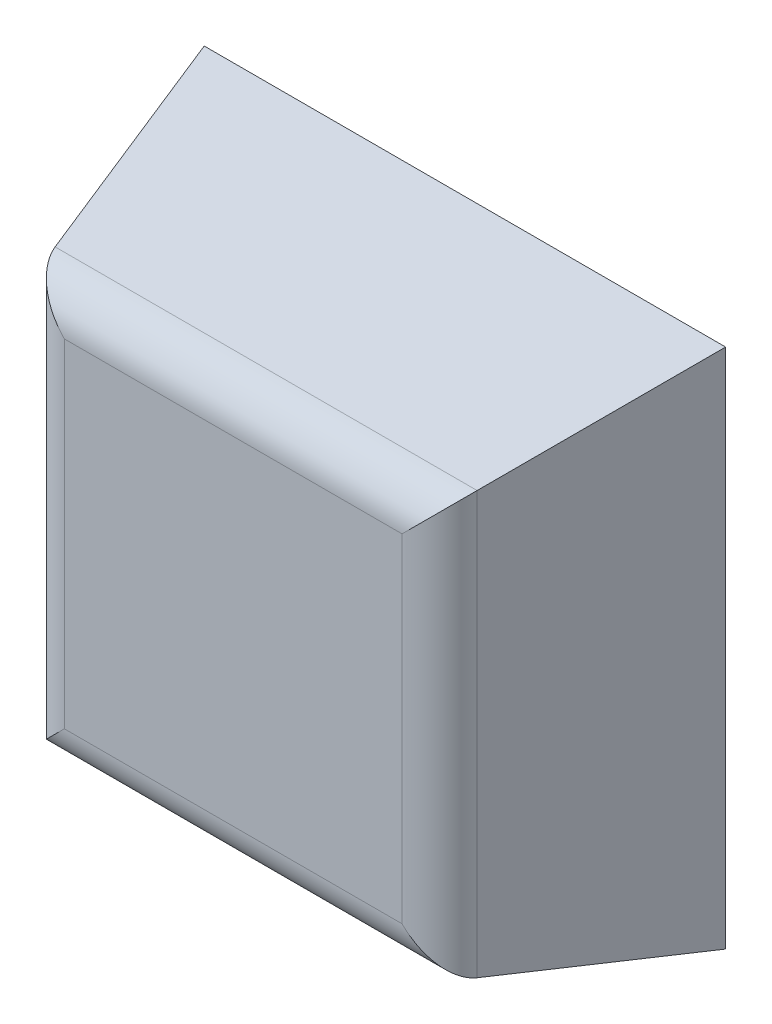
ISO-10303-21;
HEADER;
FILE_DESCRIPTION(('STEP AP214'),'2;1');
FILE_NAME('part.step','',(''),(''),'','','');
FILE_SCHEMA(('AUTOMOTIVE_DESIGN { 1 0 10303 214 1 1 1 1 }'));
ENDSEC;
DATA;
#1=APPLICATION_CONTEXT('core data for automotive mechanical design processes');
#2=APPLICATION_PROTOCOL_DEFINITION('international standard','automotive_design',2000,#1);
#3=PRODUCT_CONTEXT('',#1,'mechanical');
#4=PRODUCT('Part','Part','',(#3));
#5=PRODUCT_RELATED_PRODUCT_CATEGORY('part','',(#4));
#6=PRODUCT_DEFINITION_FORMATION('','',#4);
#7=PRODUCT_DEFINITION_CONTEXT('part definition',#1,'design');
#8=PRODUCT_DEFINITION('design','',#6,#7);
#9=PRODUCT_DEFINITION_SHAPE('','',#8);
#10=(LENGTH_UNIT() NAMED_UNIT(*) SI_UNIT(.MILLI.,.METRE.));
#11=(NAMED_UNIT(*) PLANE_ANGLE_UNIT() SI_UNIT($,.RADIAN.));
#12=(NAMED_UNIT(*) SI_UNIT($,.STERADIAN.) SOLID_ANGLE_UNIT());
#13=UNCERTAINTY_MEASURE_WITH_UNIT(LENGTH_MEASURE(1.E-05),#10,'distance_accuracy_value','');
#14=(GEOMETRIC_REPRESENTATION_CONTEXT(3) GLOBAL_UNCERTAINTY_ASSIGNED_CONTEXT((#13)) GLOBAL_UNIT_ASSIGNED_CONTEXT((#10,
#11,#12)) REPRESENTATION_CONTEXT('',''));
#15=CARTESIAN_POINT('',(0.,0.,0.));
#16=DIRECTION('',(0.,0.,1.));
#17=DIRECTION('',(1.,0.,0.));
#18=AXIS2_PLACEMENT_3D('',#15,#16,#17);
#19=CARTESIAN_POINT('',(0.,0.,0.));
#20=DIRECTION('',(0.,0.,1.));
#21=DIRECTION('',(1.,0.,0.));
#22=AXIS2_PLACEMENT_3D('',#19,#20,#21);
#23=PLANE('',#22);
#24=DIRECTION('',(0.,-1.,0.));
#25=VECTOR('',#24,1.);
#26=CARTESIAN_POINT('',(-9.,9.,0.));
#27=LINE('',#26,#25);
#28=CARTESIAN_POINT('',(-9.,9.,0.));
#29=VERTEX_POINT('',#28);
#30=CARTESIAN_POINT('',(-9.,-9.,0.));
#31=VERTEX_POINT('',#30);
#32=EDGE_CURVE('E169',#29,#31,#27,.T.);
#33=ORIENTED_EDGE('',*,*,#32,.F.);
#34=DIRECTION('',(-1.,0.,0.));
#35=VECTOR('',#34,1.);
#36=CARTESIAN_POINT('',(9.,9.,0.));
#37=LINE('',#36,#35);
#38=CARTESIAN_POINT('',(9.,9.,0.));
#39=VERTEX_POINT('',#38);
#40=EDGE_CURVE('E185',#39,#29,#37,.T.);
#41=ORIENTED_EDGE('',*,*,#40,.F.);
#42=DIRECTION('',(0.,1.,0.));
#43=VECTOR('',#42,1.);
#44=CARTESIAN_POINT('',(9.,-9.,0.));
#45=LINE('',#44,#43);
#46=CARTESIAN_POINT('',(9.,-9.,0.));
#47=VERTEX_POINT('',#46);
#48=EDGE_CURVE('E238',#47,#39,#45,.T.);
#49=ORIENTED_EDGE('',*,*,#48,.F.);
#50=DIRECTION('',(1.,0.,0.));
#51=VECTOR('',#50,1.);
#52=CARTESIAN_POINT('',(-9.,-9.,0.));
#53=LINE('',#52,#51);
#54=EDGE_CURVE('E176',#31,#47,#53,.T.);
#55=ORIENTED_EDGE('',*,*,#54,.F.);
#56=EDGE_LOOP('',(#33,#41,#49,#55));
#57=FACE_BOUND('',#56,.T.);
#58=DIRECTION('',(0.,-1.,0.));
#59=VECTOR('',#58,1.);
#60=CARTESIAN_POINT('',(-6.,6.,0.));
#61=LINE('',#60,#59);
#62=CARTESIAN_POINT('',(-6.,6.,0.));
#63=VERTEX_POINT('',#62);
#64=CARTESIAN_POINT('',(-6.,-6.,0.));
#65=VERTEX_POINT('',#64);
#66=EDGE_CURVE('E338',#63,#65,#61,.T.);
#67=ORIENTED_EDGE('',*,*,#66,.T.);
#68=DIRECTION('',(1.,0.,0.));
#69=VECTOR('',#68,1.);
#70=CARTESIAN_POINT('',(-6.,-6.,0.));
#71=LINE('',#70,#69);
#72=CARTESIAN_POINT('',(6.,-6.,0.));
#73=VERTEX_POINT('',#72);
#74=EDGE_CURVE('E167',#65,#73,#71,.T.);
#75=ORIENTED_EDGE('',*,*,#74,.T.);
#76=DIRECTION('',(0.,1.,0.));
#77=VECTOR('',#76,1.);
#78=CARTESIAN_POINT('',(6.,-6.,0.));
#79=LINE('',#78,#77);
#80=CARTESIAN_POINT('',(6.,6.,0.));
#81=VERTEX_POINT('',#80);
#82=EDGE_CURVE('E347',#73,#81,#79,.T.);
#83=ORIENTED_EDGE('',*,*,#82,.T.);
#84=DIRECTION('',(-1.,0.,0.));
#85=VECTOR('',#84,1.);
#86=CARTESIAN_POINT('',(6.,6.,0.));
#87=LINE('',#86,#85);
#88=EDGE_CURVE('E163',#81,#63,#87,.T.);
#89=ORIENTED_EDGE('',*,*,#88,.T.);
#90=EDGE_LOOP('',(#67,#75,#83,#89));
#91=FACE_BOUND('',#90,.T.);
#92=ADVANCED_FACE('F61',(#57,#91),#23,.F.);
#93=CARTESIAN_POINT('',(0.,0.,8.));
#94=DIRECTION('',(0.,0.,1.));
#95=DIRECTION('',(1.,0.,0.));
#96=AXIS2_PLACEMENT_3D('',#93,#94,#95);
#97=PLANE('',#96);
#98=DIRECTION('',(0.,-1.,0.));
#99=VECTOR('',#98,1.);
#100=CARTESIAN_POINT('',(-5.82883539039338,-7.,8.));
#101=LINE('',#100,#99);
#102=CARTESIAN_POINT('',(-5.82883539039338,5.82883539039338,8.));
#103=VERTEX_POINT('',#102);
#104=CARTESIAN_POINT('',(-5.82883539039338,-5.82883539039338,8.));
#105=VERTEX_POINT('',#104);
#106=EDGE_CURVE('E309',#103,#105,#101,.T.);
#107=ORIENTED_EDGE('',*,*,#106,.T.);
#108=DIRECTION('',(1.,0.,0.));
#109=VECTOR('',#108,1.);
#110=CARTESIAN_POINT('',(7.,-5.82883539039338,8.));
#111=LINE('',#110,#109);
#112=CARTESIAN_POINT('',(5.82883539039338,-5.82883539039338,8.));
#113=VERTEX_POINT('',#112);
#114=EDGE_CURVE('E313',#105,#113,#111,.T.);
#115=ORIENTED_EDGE('',*,*,#114,.T.);
#116=DIRECTION('',(0.,1.,0.));
#117=VECTOR('',#116,1.);
#118=CARTESIAN_POINT('',(5.82883539039338,7.,8.));
#119=LINE('',#118,#117);
#120=CARTESIAN_POINT('',(5.82883539039338,5.82883539039338,8.));
#121=VERTEX_POINT('',#120);
#122=EDGE_CURVE('E306',#113,#121,#119,.T.);
#123=ORIENTED_EDGE('',*,*,#122,.T.);
#124=DIRECTION('',(-1.,0.,0.));
#125=VECTOR('',#124,1.);
#126=CARTESIAN_POINT('',(-7.,5.82883539039338,8.));
#127=LINE('',#126,#125);
#128=EDGE_CURVE('E298',#121,#103,#127,.T.);
#129=ORIENTED_EDGE('',*,*,#128,.T.);
#130=EDGE_LOOP('',(#107,#115,#123,#129));
#131=FACE_BOUND('',#130,.T.);
#132=ADVANCED_FACE('F273',(#131),#97,.T.);
#133=CARTESIAN_POINT('',(-8.47058823529412,0.,2.11764705882353));
#134=DIRECTION('',(0.970142500145332,0.,-0.242535625036333));
#135=DIRECTION('',(-0.242535625036333,0.,-0.970142500145332));
#136=AXIS2_PLACEMENT_3D('',#133,#134,#135);
#137=PLANE('',#136);
#138=DIRECTION('',(0.235702260395516,0.235702260395516,0.942809041582063));
#139=VECTOR('',#138,1.);
#140=CARTESIAN_POINT('',(-9.,-9.,0.));
#141=LINE('',#140,#139);
#142=CARTESIAN_POINT('',(-7.28404914061137,-7.28404914061137,6.8638034375545));
#143=VERTEX_POINT('',#142);
#144=EDGE_CURVE('E253',#31,#143,#141,.T.);
#145=ORIENTED_EDGE('',*,*,#144,.T.);
#146=DIRECTION('',(0.,-1.,0.));
#147=VECTOR('',#146,1.);
#148=CARTESIAN_POINT('',(-7.28404914061137,7.,6.8638034375545));
#149=LINE('',#148,#147);
#150=CARTESIAN_POINT('',(-7.28404914061137,7.28404914061137,6.8638034375545));
#151=VERTEX_POINT('',#150);
#152=EDGE_CURVE('E316',#143,#151,#149,.F.);
#153=ORIENTED_EDGE('',*,*,#152,.T.);
#154=DIRECTION('',(0.235702260395516,-0.235702260395516,0.942809041582063));
#155=VECTOR('',#154,1.);
#156=CARTESIAN_POINT('',(-9.,9.,0.));
#157=LINE('',#156,#155);
#158=EDGE_CURVE('E233',#29,#151,#157,.T.);
#159=ORIENTED_EDGE('',*,*,#158,.F.);
#160=ORIENTED_EDGE('',*,*,#32,.T.);
#161=EDGE_LOOP('',(#145,#153,#159,#160));
#162=FACE_BOUND('',#161,.T.);
#163=ADVANCED_FACE('F207',(#162),#137,.F.);
#164=CARTESIAN_POINT('',(0.,8.47058823529412,2.11764705882353));
#165=DIRECTION('',(0.,-0.970142500145332,-0.242535625036333));
#166=DIRECTION('',(0.,0.242535625036333,-0.970142500145332));
#167=AXIS2_PLACEMENT_3D('',#164,#165,#166);
#168=PLANE('',#167);
#169=ORIENTED_EDGE('',*,*,#158,.T.);
#170=DIRECTION('',(-1.,0.,0.));
#171=VECTOR('',#170,1.);
#172=CARTESIAN_POINT('',(7.,7.28404914061137,6.8638034375545));
#173=LINE('',#172,#171);
#174=CARTESIAN_POINT('',(7.28404914061137,7.28404914061137,6.8638034375545));
#175=VERTEX_POINT('',#174);
#176=EDGE_CURVE('E12',#151,#175,#173,.F.);
#177=ORIENTED_EDGE('',*,*,#176,.T.);
#178=DIRECTION('',(-0.235702260395516,-0.235702260395516,0.942809041582063));
#179=VECTOR('',#178,1.);
#180=CARTESIAN_POINT('',(9.,9.,0.));
#181=LINE('',#180,#179);
#182=EDGE_CURVE('E191',#39,#175,#181,.T.);
#183=ORIENTED_EDGE('',*,*,#182,.F.);
#184=ORIENTED_EDGE('',*,*,#40,.T.);
#185=EDGE_LOOP('',(#169,#177,#183,#184));
#186=FACE_BOUND('',#185,.T.);
#187=ADVANCED_FACE('F194',(#186),#168,.F.);
#188=CARTESIAN_POINT('',(0.,-8.47058823529412,2.11764705882353));
#189=DIRECTION('',(0.,0.970142500145332,-0.242535625036333));
#190=DIRECTION('',(0.,0.242535625036333,0.970142500145332));
#191=AXIS2_PLACEMENT_3D('',#188,#189,#190);
#192=PLANE('',#191);
#193=DIRECTION('',(-0.235702260395516,0.235702260395516,0.942809041582063));
#194=VECTOR('',#193,1.);
#195=CARTESIAN_POINT('',(9.,-9.,0.));
#196=LINE('',#195,#194);
#197=CARTESIAN_POINT('',(7.28404914061137,-7.28404914061137,6.8638034375545));
#198=VERTEX_POINT('',#197);
#199=EDGE_CURVE('E225',#47,#198,#196,.T.);
#200=ORIENTED_EDGE('',*,*,#199,.T.);
#201=DIRECTION('',(1.,0.,0.));
#202=VECTOR('',#201,1.);
#203=CARTESIAN_POINT('',(-7.,-7.28404914061137,6.8638034375545));
#204=LINE('',#203,#202);
#205=EDGE_CURVE('E72',#198,#143,#204,.F.);
#206=ORIENTED_EDGE('',*,*,#205,.T.);
#207=ORIENTED_EDGE('',*,*,#144,.F.);
#208=ORIENTED_EDGE('',*,*,#54,.T.);
#209=EDGE_LOOP('',(#200,#206,#207,#208));
#210=FACE_BOUND('',#209,.T.);
#211=ADVANCED_FACE('F206',(#210),#192,.F.);
#212=CARTESIAN_POINT('',(8.47058823529412,0.,2.11764705882353));
#213=DIRECTION('',(-0.970142500145332,0.,-0.242535625036333));
#214=DIRECTION('',(-0.242535625036333,0.,0.970142500145332));
#215=AXIS2_PLACEMENT_3D('',#212,#213,#214);
#216=PLANE('',#215);
#217=ORIENTED_EDGE('',*,*,#182,.T.);
#218=DIRECTION('',(0.,1.,0.));
#219=VECTOR('',#218,1.);
#220=CARTESIAN_POINT('',(7.28404914061137,-7.,6.8638034375545));
#221=LINE('',#220,#219);
#222=EDGE_CURVE('E80',#175,#198,#221,.F.);
#223=ORIENTED_EDGE('',*,*,#222,.T.);
#224=ORIENTED_EDGE('',*,*,#199,.F.);
#225=ORIENTED_EDGE('',*,*,#48,.T.);
#226=EDGE_LOOP('',(#217,#223,#224,#225));
#227=FACE_BOUND('',#226,.T.);
#228=ADVANCED_FACE('F214',(#227),#216,.F.);
#229=CARTESIAN_POINT('',(-6.,6.,3.));
#230=DIRECTION('',(1.,0.,0.));
#231=DIRECTION('',(0.,0.,-1.));
#232=AXIS2_PLACEMENT_3D('',#229,#230,#231);
#233=PLANE('',#232);
#234=ORIENTED_EDGE('',*,*,#66,.F.);
#235=DIRECTION('',(0.,0.,-1.));
#236=VECTOR('',#235,1.);
#237=CARTESIAN_POINT('',(-6.,6.,3.));
#238=LINE('',#237,#236);
#239=CARTESIAN_POINT('',(-6.,6.,3.));
#240=VERTEX_POINT('',#239);
#241=EDGE_CURVE('E161',#240,#63,#238,.T.);
#242=ORIENTED_EDGE('',*,*,#241,.F.);
#243=DIRECTION('',(0.,-1.,0.));
#244=VECTOR('',#243,1.);
#245=CARTESIAN_POINT('',(-6.,6.,3.));
#246=LINE('',#245,#244);
#247=CARTESIAN_POINT('',(-6.,-6.,3.));
#248=VERTEX_POINT('',#247);
#249=EDGE_CURVE('E147',#240,#248,#246,.T.);
#250=ORIENTED_EDGE('',*,*,#249,.T.);
#251=DIRECTION('',(0.,0.,-1.));
#252=VECTOR('',#251,1.);
#253=CARTESIAN_POINT('',(-6.,-6.,3.));
#254=LINE('',#253,#252);
#255=EDGE_CURVE('E158',#248,#65,#254,.T.);
#256=ORIENTED_EDGE('',*,*,#255,.T.);
#257=EDGE_LOOP('',(#234,#242,#250,#256));
#258=FACE_BOUND('',#257,.T.);
#259=ADVANCED_FACE('F157',(#258),#233,.T.);
#260=CARTESIAN_POINT('',(-6.,-6.,3.));
#261=DIRECTION('',(0.,1.,0.));
#262=DIRECTION('',(0.,0.,1.));
#263=AXIS2_PLACEMENT_3D('',#260,#261,#262);
#264=PLANE('',#263);
#265=ORIENTED_EDGE('',*,*,#74,.F.);
#266=ORIENTED_EDGE('',*,*,#255,.F.);
#267=DIRECTION('',(1.,0.,0.));
#268=VECTOR('',#267,1.);
#269=CARTESIAN_POINT('',(-6.,-6.,3.));
#270=LINE('',#269,#268);
#271=CARTESIAN_POINT('',(6.,-6.,3.));
#272=VERTEX_POINT('',#271);
#273=EDGE_CURVE('E143',#248,#272,#270,.T.);
#274=ORIENTED_EDGE('',*,*,#273,.T.);
#275=DIRECTION('',(0.,0.,-1.));
#276=VECTOR('',#275,1.);
#277=CARTESIAN_POINT('',(6.,-6.,3.));
#278=LINE('',#277,#276);
#279=EDGE_CURVE('E170',#272,#73,#278,.T.);
#280=ORIENTED_EDGE('',*,*,#279,.T.);
#281=EDGE_LOOP('',(#265,#266,#274,#280));
#282=FACE_BOUND('',#281,.T.);
#283=ADVANCED_FACE('F165',(#282),#264,.T.);
#284=CARTESIAN_POINT('',(6.,-6.,3.));
#285=DIRECTION('',(-1.,0.,0.));
#286=DIRECTION('',(0.,0.,1.));
#287=AXIS2_PLACEMENT_3D('',#284,#285,#286);
#288=PLANE('',#287);
#289=ORIENTED_EDGE('',*,*,#82,.F.);
#290=ORIENTED_EDGE('',*,*,#279,.F.);
#291=DIRECTION('',(0.,1.,0.));
#292=VECTOR('',#291,1.);
#293=CARTESIAN_POINT('',(6.,-6.,3.));
#294=LINE('',#293,#292);
#295=CARTESIAN_POINT('',(6.,6.,3.));
#296=VERTEX_POINT('',#295);
#297=EDGE_CURVE('E148',#272,#296,#294,.T.);
#298=ORIENTED_EDGE('',*,*,#297,.T.);
#299=DIRECTION('',(0.,0.,-1.));
#300=VECTOR('',#299,1.);
#301=CARTESIAN_POINT('',(6.,6.,3.));
#302=LINE('',#301,#300);
#303=EDGE_CURVE('E179',#296,#81,#302,.T.);
#304=ORIENTED_EDGE('',*,*,#303,.T.);
#305=EDGE_LOOP('',(#289,#290,#298,#304));
#306=FACE_BOUND('',#305,.T.);
#307=ADVANCED_FACE('F365',(#306),#288,.T.);
#308=CARTESIAN_POINT('',(6.,6.,3.));
#309=DIRECTION('',(0.,-1.,0.));
#310=DIRECTION('',(0.,0.,-1.));
#311=AXIS2_PLACEMENT_3D('',#308,#309,#310);
#312=PLANE('',#311);
#313=ORIENTED_EDGE('',*,*,#88,.F.);
#314=ORIENTED_EDGE('',*,*,#303,.F.);
#315=DIRECTION('',(-1.,0.,0.));
#316=VECTOR('',#315,1.);
#317=CARTESIAN_POINT('',(6.,6.,3.));
#318=LINE('',#317,#316);
#319=EDGE_CURVE('E350',#296,#240,#318,.T.);
#320=ORIENTED_EDGE('',*,*,#319,.T.);
#321=ORIENTED_EDGE('',*,*,#241,.T.);
#322=EDGE_LOOP('',(#313,#314,#320,#321));
#323=FACE_BOUND('',#322,.T.);
#324=ADVANCED_FACE('F367',(#323),#312,.T.);
#325=CARTESIAN_POINT('',(0.,0.,3.));
#326=DIRECTION('',(0.,0.,1.));
#327=DIRECTION('',(1.,0.,0.));
#328=AXIS2_PLACEMENT_3D('',#325,#326,#327);
#329=PLANE('',#328);
#330=ORIENTED_EDGE('',*,*,#249,.F.);
#331=ORIENTED_EDGE('',*,*,#319,.F.);
#332=ORIENTED_EDGE('',*,*,#297,.F.);
#333=ORIENTED_EDGE('',*,*,#273,.F.);
#334=EDGE_LOOP('',(#330,#331,#332,#333));
#335=FACE_BOUND('',#334,.T.);
#336=ADVANCED_FACE('F145',(#335),#329,.F.);
#337=CARTESIAN_POINT('',(5.82883539039338,0.,6.5));
#338=DIRECTION('',(0.,-1.,0.));
#339=DIRECTION('',(0.,0.,-1.));
#340=AXIS2_PLACEMENT_3D('',#337,#338,#339);
#341=CYLINDRICAL_SURFACE('',#340,1.5);
#342=CARTESIAN_POINT('',(5.82883539039338,-5.82883539039338,6.5));
#343=DIRECTION('',(-0.707106781186547,-0.707106781186547,0.));
#344=DIRECTION('',(-0.707106781186547,0.707106781186547,0.));
#345=AXIS2_PLACEMENT_3D('',#342,#343,#344);
#346=ELLIPSE('',#345,2.12132034355964,1.5);
#347=EDGE_CURVE('E329',#198,#113,#346,.T.);
#348=ORIENTED_EDGE('',*,*,#347,.F.);
#349=ORIENTED_EDGE('',*,*,#222,.F.);
#350=CARTESIAN_POINT('',(5.82883539039338,5.82883539039338,6.5));
#351=DIRECTION('',(0.707106781186547,-0.707106781186547,0.));
#352=DIRECTION('',(0.707106781186547,0.707106781186547,0.));
#353=AXIS2_PLACEMENT_3D('',#350,#351,#352);
#354=ELLIPSE('',#353,2.12132034355964,1.5);
#355=EDGE_CURVE('E66',#121,#175,#354,.F.);
#356=ORIENTED_EDGE('',*,*,#355,.F.);
#357=ORIENTED_EDGE('',*,*,#122,.F.);
#358=EDGE_LOOP('',(#348,#349,#356,#357));
#359=FACE_BOUND('',#358,.T.);
#360=ADVANCED_FACE('F64',(#359),#341,.T.);
#361=CARTESIAN_POINT('',(0.,5.82883539039338,6.5));
#362=DIRECTION('',(1.,0.,0.));
#363=DIRECTION('',(0.,0.,-1.));
#364=AXIS2_PLACEMENT_3D('',#361,#362,#363);
#365=CYLINDRICAL_SURFACE('',#364,1.5);
#366=ORIENTED_EDGE('',*,*,#355,.T.);
#367=ORIENTED_EDGE('',*,*,#176,.F.);
#368=CARTESIAN_POINT('',(-5.82883539039338,5.82883539039338,6.5));
#369=DIRECTION('',(0.707106781186547,0.707106781186547,0.));
#370=DIRECTION('',(0.707106781186547,-0.707106781186547,0.));
#371=AXIS2_PLACEMENT_3D('',#368,#369,#370);
#372=ELLIPSE('',#371,2.12132034355964,1.5);
#373=EDGE_CURVE('E327',#103,#151,#372,.F.);
#374=ORIENTED_EDGE('',*,*,#373,.F.);
#375=ORIENTED_EDGE('',*,*,#128,.F.);
#376=EDGE_LOOP('',(#366,#367,#374,#375));
#377=FACE_BOUND('',#376,.T.);
#378=ADVANCED_FACE('F400',(#377),#365,.T.);
#379=CARTESIAN_POINT('',(0.,-5.82883539039338,6.5));
#380=DIRECTION('',(-1.,0.,0.));
#381=DIRECTION('',(0.,0.,1.));
#382=AXIS2_PLACEMENT_3D('',#379,#380,#381);
#383=CYLINDRICAL_SURFACE('',#382,1.5);
#384=ORIENTED_EDGE('',*,*,#347,.T.);
#385=ORIENTED_EDGE('',*,*,#114,.F.);
#386=CARTESIAN_POINT('',(-5.82883539039338,-5.82883539039338,6.5));
#387=DIRECTION('',(-0.707106781186547,0.707106781186547,0.));
#388=DIRECTION('',(-0.707106781186547,-0.707106781186547,0.));
#389=AXIS2_PLACEMENT_3D('',#386,#387,#388);
#390=ELLIPSE('',#389,2.12132034355964,1.5);
#391=EDGE_CURVE('E324',#143,#105,#390,.T.);
#392=ORIENTED_EDGE('',*,*,#391,.F.);
#393=ORIENTED_EDGE('',*,*,#205,.F.);
#394=EDGE_LOOP('',(#384,#385,#392,#393));
#395=FACE_BOUND('',#394,.T.);
#396=ADVANCED_FACE('F389',(#395),#383,.T.);
#397=CARTESIAN_POINT('',(-5.82883539039338,0.,6.5));
#398=DIRECTION('',(0.,1.,0.));
#399=DIRECTION('',(0.,0.,1.));
#400=AXIS2_PLACEMENT_3D('',#397,#398,#399);
#401=CYLINDRICAL_SURFACE('',#400,1.5);
#402=ORIENTED_EDGE('',*,*,#373,.T.);
#403=ORIENTED_EDGE('',*,*,#152,.F.);
#404=ORIENTED_EDGE('',*,*,#391,.T.);
#405=ORIENTED_EDGE('',*,*,#106,.F.);
#406=EDGE_LOOP('',(#402,#403,#404,#405));
#407=FACE_BOUND('',#406,.T.);
#408=ADVANCED_FACE('F397',(#407),#401,.T.);
#409=CLOSED_SHELL('',(#92,#132,#163,#187,#211,#228,#259,#283,#307,#324,#336,#360,#378,#396,#408));
#410=MANIFOLD_SOLID_BREP('B2',#409);
#411=ADVANCED_BREP_SHAPE_REPRESENTATION('',(#18,#410),#14);
#412=SHAPE_DEFINITION_REPRESENTATION(#9,#411);
ENDSEC;
END-ISO-10303-21;
